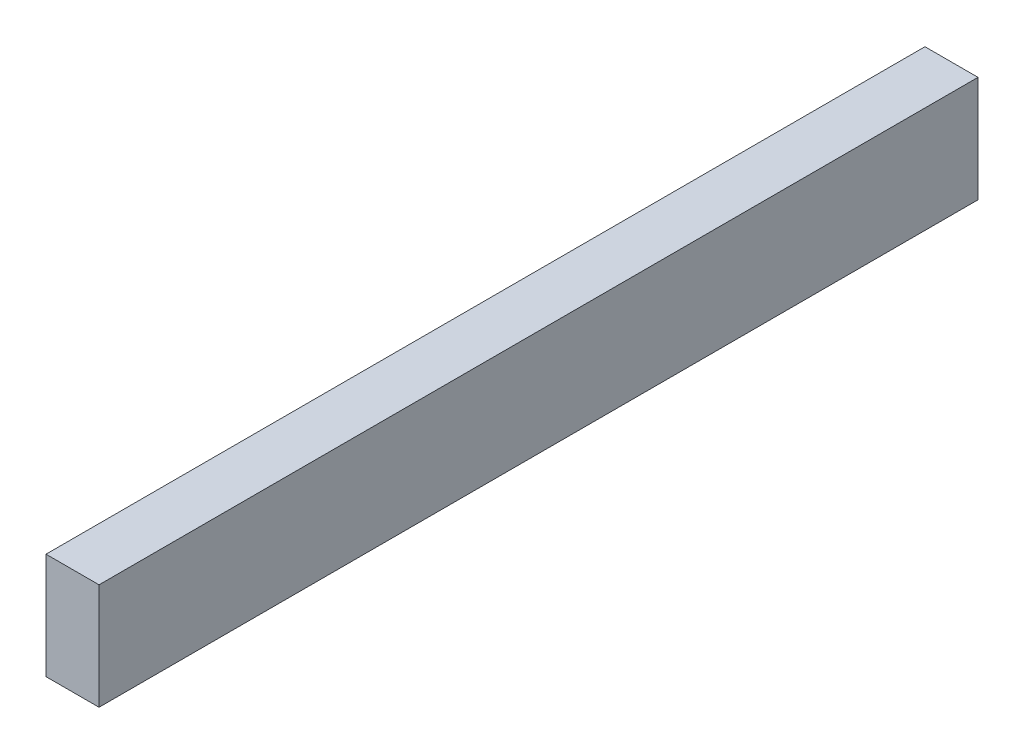
ISO-10303-21;
HEADER;
FILE_DESCRIPTION(('STEP AP214'),'2;1');
FILE_NAME('part.step','',(''),(''),'','','');
FILE_SCHEMA(('AUTOMOTIVE_DESIGN { 1 0 10303 214 1 1 1 1 }'));
ENDSEC;
DATA;
#1=APPLICATION_CONTEXT('core data for automotive mechanical design processes');
#2=APPLICATION_PROTOCOL_DEFINITION('international standard','automotive_design',2000,#1);
#3=PRODUCT_CONTEXT('',#1,'mechanical');
#4=PRODUCT('Part','Part','',(#3));
#5=PRODUCT_RELATED_PRODUCT_CATEGORY('part','',(#4));
#6=PRODUCT_DEFINITION_FORMATION('','',#4);
#7=PRODUCT_DEFINITION_CONTEXT('part definition',#1,'design');
#8=PRODUCT_DEFINITION('design','',#6,#7);
#9=PRODUCT_DEFINITION_SHAPE('','',#8);
#10=(LENGTH_UNIT() NAMED_UNIT(*) SI_UNIT(.MILLI.,.METRE.));
#11=(NAMED_UNIT(*) PLANE_ANGLE_UNIT() SI_UNIT($,.RADIAN.));
#12=(NAMED_UNIT(*) SI_UNIT($,.STERADIAN.) SOLID_ANGLE_UNIT());
#13=UNCERTAINTY_MEASURE_WITH_UNIT(LENGTH_MEASURE(1.E-05),#10,'distance_accuracy_value','');
#14=(GEOMETRIC_REPRESENTATION_CONTEXT(3) GLOBAL_UNCERTAINTY_ASSIGNED_CONTEXT((#13)) GLOBAL_UNIT_ASSIGNED_CONTEXT((#10,
#11,#12)) REPRESENTATION_CONTEXT('',''));
#15=CARTESIAN_POINT('',(0.,0.,0.));
#16=DIRECTION('',(0.,0.,1.));
#17=DIRECTION('',(1.,0.,0.));
#18=AXIS2_PLACEMENT_3D('',#15,#16,#17);
#19=CARTESIAN_POINT('',(0.,0.,368.3));
#20=DIRECTION('',(1.,0.,0.));
#21=DIRECTION('',(0.,0.,-1.));
#22=AXIS2_PLACEMENT_3D('',#19,#20,#21);
#23=PLANE('',#22);
#24=DIRECTION('',(0.,-1.,0.));
#25=VECTOR('',#24,1.);
#26=CARTESIAN_POINT('',(0.,0.,0.));
#27=LINE('',#26,#25);
#28=CARTESIAN_POINT('',(0.,44.45,0.));
#29=VERTEX_POINT('',#28);
#30=CARTESIAN_POINT('',(0.,0.,0.));
#31=VERTEX_POINT('',#30);
#32=EDGE_CURVE('E98',#29,#31,#27,.T.);
#33=ORIENTED_EDGE('',*,*,#32,.T.);
#34=DIRECTION('',(0.,0.,-1.));
#35=VECTOR('',#34,1.);
#36=CARTESIAN_POINT('',(0.,0.,368.3));
#37=LINE('',#36,#35);
#38=CARTESIAN_POINT('',(0.,0.,368.3));
#39=VERTEX_POINT('',#38);
#40=EDGE_CURVE('E11',#39,#31,#37,.T.);
#41=ORIENTED_EDGE('',*,*,#40,.F.);
#42=DIRECTION('',(0.,-1.,0.));
#43=VECTOR('',#42,1.);
#44=CARTESIAN_POINT('',(0.,0.,368.3));
#45=LINE('',#44,#43);
#46=CARTESIAN_POINT('',(0.,44.45,368.3));
#47=VERTEX_POINT('',#46);
#48=EDGE_CURVE('E86',#47,#39,#45,.T.);
#49=ORIENTED_EDGE('',*,*,#48,.F.);
#50=DIRECTION('',(0.,0.,-1.));
#51=VECTOR('',#50,1.);
#52=CARTESIAN_POINT('',(0.,44.45,368.3));
#53=LINE('',#52,#51);
#54=EDGE_CURVE('E94',#47,#29,#53,.T.);
#55=ORIENTED_EDGE('',*,*,#54,.T.);
#56=EDGE_LOOP('',(#33,#41,#49,#55));
#57=FACE_BOUND('',#56,.T.);
#58=ADVANCED_FACE('F35',(#57),#23,.F.);
#59=CARTESIAN_POINT('',(0.,0.,368.3));
#60=DIRECTION('',(0.,1.,0.));
#61=DIRECTION('',(0.,0.,1.));
#62=AXIS2_PLACEMENT_3D('',#59,#60,#61);
#63=PLANE('',#62);
#64=DIRECTION('',(1.,0.,0.));
#65=VECTOR('',#64,1.);
#66=CARTESIAN_POINT('',(0.,0.,0.));
#67=LINE('',#66,#65);
#68=CARTESIAN_POINT('',(22.225,0.,0.));
#69=VERTEX_POINT('',#68);
#70=EDGE_CURVE('E90',#31,#69,#67,.T.);
#71=ORIENTED_EDGE('',*,*,#70,.T.);
#72=DIRECTION('',(0.,0.,-1.));
#73=VECTOR('',#72,1.);
#74=CARTESIAN_POINT('',(22.225,0.,368.3));
#75=LINE('',#74,#73);
#76=CARTESIAN_POINT('',(22.225,0.,368.3));
#77=VERTEX_POINT('',#76);
#78=EDGE_CURVE('E43',#77,#69,#75,.T.);
#79=ORIENTED_EDGE('',*,*,#78,.F.);
#80=DIRECTION('',(1.,0.,0.));
#81=VECTOR('',#80,1.);
#82=CARTESIAN_POINT('',(0.,0.,368.3));
#83=LINE('',#82,#81);
#84=EDGE_CURVE('E81',#39,#77,#83,.T.);
#85=ORIENTED_EDGE('',*,*,#84,.F.);
#86=ORIENTED_EDGE('',*,*,#40,.T.);
#87=EDGE_LOOP('',(#71,#79,#85,#86));
#88=FACE_BOUND('',#87,.T.);
#89=ADVANCED_FACE('F89',(#88),#63,.F.);
#90=CARTESIAN_POINT('',(22.225,0.,368.3));
#91=DIRECTION('',(-1.,0.,0.));
#92=DIRECTION('',(0.,0.,1.));
#93=AXIS2_PLACEMENT_3D('',#90,#91,#92);
#94=PLANE('',#93);
#95=DIRECTION('',(0.,1.,0.));
#96=VECTOR('',#95,1.);
#97=CARTESIAN_POINT('',(22.225,0.,0.));
#98=LINE('',#97,#96);
#99=CARTESIAN_POINT('',(22.225,44.45,0.));
#100=VERTEX_POINT('',#99);
#101=EDGE_CURVE('E68',#69,#100,#98,.T.);
#102=ORIENTED_EDGE('',*,*,#101,.T.);
#103=DIRECTION('',(0.,0.,-1.));
#104=VECTOR('',#103,1.);
#105=CARTESIAN_POINT('',(22.225,44.45,368.3));
#106=LINE('',#105,#104);
#107=CARTESIAN_POINT('',(22.225,44.45,368.3));
#108=VERTEX_POINT('',#107);
#109=EDGE_CURVE('E91',#108,#100,#106,.T.);
#110=ORIENTED_EDGE('',*,*,#109,.F.);
#111=DIRECTION('',(0.,1.,0.));
#112=VECTOR('',#111,1.);
#113=CARTESIAN_POINT('',(22.225,0.,368.3));
#114=LINE('',#113,#112);
#115=EDGE_CURVE('E84',#77,#108,#114,.T.);
#116=ORIENTED_EDGE('',*,*,#115,.F.);
#117=ORIENTED_EDGE('',*,*,#78,.T.);
#118=EDGE_LOOP('',(#102,#110,#116,#117));
#119=FACE_BOUND('',#118,.T.);
#120=ADVANCED_FACE('F92',(#119),#94,.F.);
#121=CARTESIAN_POINT('',(0.,44.45,368.3));
#122=DIRECTION('',(0.,-1.,0.));
#123=DIRECTION('',(0.,0.,-1.));
#124=AXIS2_PLACEMENT_3D('',#121,#122,#123);
#125=PLANE('',#124);
#126=DIRECTION('',(-1.,0.,0.));
#127=VECTOR('',#126,1.);
#128=CARTESIAN_POINT('',(0.,44.45,0.));
#129=LINE('',#128,#127);
#130=EDGE_CURVE('E74',#100,#29,#129,.T.);
#131=ORIENTED_EDGE('',*,*,#130,.T.);
#132=ORIENTED_EDGE('',*,*,#54,.F.);
#133=DIRECTION('',(-1.,0.,0.));
#134=VECTOR('',#133,1.);
#135=CARTESIAN_POINT('',(0.,44.45,368.3));
#136=LINE('',#135,#134);
#137=EDGE_CURVE('E51',#108,#47,#136,.T.);
#138=ORIENTED_EDGE('',*,*,#137,.F.);
#139=ORIENTED_EDGE('',*,*,#109,.T.);
#140=EDGE_LOOP('',(#131,#132,#138,#139));
#141=FACE_BOUND('',#140,.T.);
#142=ADVANCED_FACE('F105',(#141),#125,.F.);
#143=CARTESIAN_POINT('',(0.,0.,368.3));
#144=DIRECTION('',(0.,0.,-1.));
#145=DIRECTION('',(-1.,0.,0.));
#146=AXIS2_PLACEMENT_3D('',#143,#144,#145);
#147=PLANE('',#146);
#148=ORIENTED_EDGE('',*,*,#48,.T.);
#149=ORIENTED_EDGE('',*,*,#84,.T.);
#150=ORIENTED_EDGE('',*,*,#115,.T.);
#151=ORIENTED_EDGE('',*,*,#137,.T.);
#152=EDGE_LOOP('',(#148,#149,#150,#151));
#153=FACE_BOUND('',#152,.T.);
#154=ADVANCED_FACE('F82',(#153),#147,.F.);
#155=CARTESIAN_POINT('',(0.,0.,0.));
#156=DIRECTION('',(0.,0.,-1.));
#157=DIRECTION('',(-1.,0.,0.));
#158=AXIS2_PLACEMENT_3D('',#155,#156,#157);
#159=PLANE('',#158);
#160=ORIENTED_EDGE('',*,*,#32,.F.);
#161=ORIENTED_EDGE('',*,*,#130,.F.);
#162=ORIENTED_EDGE('',*,*,#101,.F.);
#163=ORIENTED_EDGE('',*,*,#70,.F.);
#164=EDGE_LOOP('',(#160,#161,#162,#163));
#165=FACE_BOUND('',#164,.T.);
#166=ADVANCED_FACE('F108',(#165),#159,.T.);
#167=CLOSED_SHELL('',(#58,#89,#120,#142,#154,#166));
#168=MANIFOLD_SOLID_BREP('B2',#167);
#169=ADVANCED_BREP_SHAPE_REPRESENTATION('',(#18,#168),#14);
#170=SHAPE_DEFINITION_REPRESENTATION(#9,#169);
ENDSEC;
END-ISO-10303-21;
